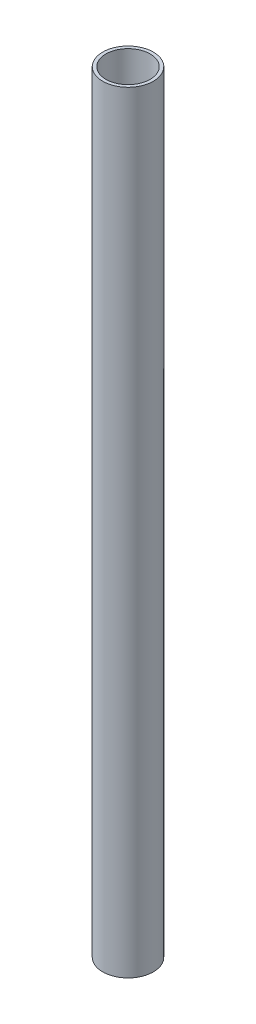
ISO-10303-21;
HEADER;
FILE_DESCRIPTION(('STEP AP214'),'2;1');
FILE_NAME('part.step','',(''),(''),'','','');
FILE_SCHEMA(('AUTOMOTIVE_DESIGN { 1 0 10303 214 1 1 1 1 }'));
ENDSEC;
DATA;
#1=APPLICATION_CONTEXT('core data for automotive mechanical design processes');
#2=APPLICATION_PROTOCOL_DEFINITION('international standard','automotive_design',2000,#1);
#3=PRODUCT_CONTEXT('',#1,'mechanical');
#4=PRODUCT('Part','Part','',(#3));
#5=PRODUCT_RELATED_PRODUCT_CATEGORY('part','',(#4));
#6=PRODUCT_DEFINITION_FORMATION('','',#4);
#7=PRODUCT_DEFINITION_CONTEXT('part definition',#1,'design');
#8=PRODUCT_DEFINITION('design','',#6,#7);
#9=PRODUCT_DEFINITION_SHAPE('','',#8);
#10=(LENGTH_UNIT() NAMED_UNIT(*) SI_UNIT(.MILLI.,.METRE.));
#11=(NAMED_UNIT(*) PLANE_ANGLE_UNIT() SI_UNIT($,.RADIAN.));
#12=(NAMED_UNIT(*) SI_UNIT($,.STERADIAN.) SOLID_ANGLE_UNIT());
#13=UNCERTAINTY_MEASURE_WITH_UNIT(LENGTH_MEASURE(1.E-05),#10,'distance_accuracy_value','');
#14=(GEOMETRIC_REPRESENTATION_CONTEXT(3) GLOBAL_UNCERTAINTY_ASSIGNED_CONTEXT((#13)) GLOBAL_UNIT_ASSIGNED_CONTEXT((#10,
#11,#12)) REPRESENTATION_CONTEXT('',''));
#15=CARTESIAN_POINT('',(0.,0.,0.));
#16=DIRECTION('',(0.,0.,1.));
#17=DIRECTION('',(1.,0.,0.));
#18=AXIS2_PLACEMENT_3D('',#15,#16,#17);
#19=CARTESIAN_POINT('',(327.743353345829,523.888649336886,-1312.55924615483));
#20=DIRECTION('',(0.,1.,0.));
#21=DIRECTION('',(0.,0.,1.));
#22=AXIS2_PLACEMENT_3D('',#19,#20,#21);
#23=PLANE('',#22);
#24=CARTESIAN_POINT('',(327.743353345829,523.888649336886,-1312.55924615483));
#25=DIRECTION('',(0.,1.,0.));
#26=DIRECTION('',(0.,0.,1.));
#27=AXIS2_PLACEMENT_3D('',#24,#25,#26);
#28=CIRCLE('',#27,20.0025);
#29=CARTESIAN_POINT('',(327.743353345829,523.888649336886,-1332.56174615483));
#30=VERTEX_POINT('',#29);
#31=EDGE_CURVE('E10',#30,#30,#28,.T.);
#32=ORIENTED_EDGE('',*,*,#31,.T.);
#33=EDGE_LOOP('',(#32));
#34=FACE_BOUND('',#33,.T.);
#35=CARTESIAN_POINT('',(327.743353345829,523.888649336886,-1312.55924615483));
#36=DIRECTION('',(0.,1.,0.));
#37=DIRECTION('',(0.,0.,1.));
#38=AXIS2_PLACEMENT_3D('',#35,#36,#37);
#39=CIRCLE('',#38,17.4625);
#40=CARTESIAN_POINT('',(327.743353345829,523.888649336886,-1330.02174615483));
#41=VERTEX_POINT('',#40);
#42=EDGE_CURVE('E48',#41,#41,#39,.T.);
#43=ORIENTED_EDGE('',*,*,#42,.F.);
#44=EDGE_LOOP('',(#43));
#45=FACE_BOUND('',#44,.T.);
#46=ADVANCED_FACE('F37',(#34,#45),#23,.T.);
#47=CARTESIAN_POINT('',(327.743353345829,-85.7113506631138,-1312.55924615483));
#48=DIRECTION('',(0.,1.,0.));
#49=DIRECTION('',(0.,0.,1.));
#50=AXIS2_PLACEMENT_3D('',#47,#48,#49);
#51=PLANE('',#50);
#52=CARTESIAN_POINT('',(327.743353345829,-85.7113506631138,-1312.55924615483));
#53=DIRECTION('',(0.,1.,0.));
#54=DIRECTION('',(0.,0.,1.));
#55=AXIS2_PLACEMENT_3D('',#52,#53,#54);
#56=CIRCLE('',#55,20.0025);
#57=CARTESIAN_POINT('',(327.743353345829,-85.7113506631139,-1332.56174615483));
#58=VERTEX_POINT('',#57);
#59=EDGE_CURVE('E41',#58,#58,#56,.T.);
#60=ORIENTED_EDGE('',*,*,#59,.F.);
#61=EDGE_LOOP('',(#60));
#62=FACE_BOUND('',#61,.T.);
#63=CARTESIAN_POINT('',(327.743353345829,-85.7113506631138,-1312.55924615483));
#64=DIRECTION('',(0.,1.,0.));
#65=DIRECTION('',(0.,0.,1.));
#66=AXIS2_PLACEMENT_3D('',#63,#64,#65);
#67=CIRCLE('',#66,17.4625);
#68=CARTESIAN_POINT('',(327.743353345829,-85.7113506631139,-1330.02174615483));
#69=VERTEX_POINT('',#68);
#70=EDGE_CURVE('E50',#69,#69,#67,.T.);
#71=ORIENTED_EDGE('',*,*,#70,.T.);
#72=EDGE_LOOP('',(#71));
#73=FACE_BOUND('',#72,.T.);
#74=ADVANCED_FACE('F60',(#62,#73),#51,.F.);
#75=CARTESIAN_POINT('',(327.743353345829,523.888649336886,-1312.55924615483));
#76=DIRECTION('',(0.,-1.,0.));
#77=DIRECTION('',(0.,0.,-1.));
#78=AXIS2_PLACEMENT_3D('',#75,#76,#77);
#79=CYLINDRICAL_SURFACE('',#78,20.0025);
#80=CARTESIAN_POINT('',(327.743353345829,523.888649336886,-1332.56174615483));
#81=CARTESIAN_POINT('',(327.743353345829,517.538649336886,-1332.56174615483));
#82=CARTESIAN_POINT('',(327.743353345829,511.188649336886,-1332.56174615483));
#83=CARTESIAN_POINT('',(327.743353345829,498.488649336886,-1332.56174615483));
#84=CARTESIAN_POINT('',(327.743353345829,492.138649336886,-1332.56174615483));
#85=CARTESIAN_POINT('',(327.743353345829,479.438649336886,-1332.56174615483));
#86=CARTESIAN_POINT('',(327.743353345829,473.088649336886,-1332.56174615483));
#87=CARTESIAN_POINT('',(327.743353345829,460.388649336886,-1332.56174615483));
#88=CARTESIAN_POINT('',(327.743353345829,454.038649336886,-1332.56174615483));
#89=CARTESIAN_POINT('',(327.743353345829,441.338649336886,-1332.56174615483));
#90=CARTESIAN_POINT('',(327.743353345829,434.988649336886,-1332.56174615483));
#91=CARTESIAN_POINT('',(327.743353345829,422.288649336886,-1332.56174615483));
#92=CARTESIAN_POINT('',(327.743353345829,415.938649336886,-1332.56174615483));
#93=CARTESIAN_POINT('',(327.743353345829,403.238649336886,-1332.56174615483));
#94=CARTESIAN_POINT('',(327.743353345829,396.888649336886,-1332.56174615483));
#95=CARTESIAN_POINT('',(327.743353345829,384.188649336886,-1332.56174615483));
#96=CARTESIAN_POINT('',(327.743353345829,377.838649336886,-1332.56174615483));
#97=CARTESIAN_POINT('',(327.743353345829,365.138649336886,-1332.56174615483));
#98=CARTESIAN_POINT('',(327.743353345829,358.788649336886,-1332.56174615483));
#99=CARTESIAN_POINT('',(327.743353345829,346.088649336886,-1332.56174615483));
#100=CARTESIAN_POINT('',(327.743353345829,339.738649336886,-1332.56174615483));
#101=CARTESIAN_POINT('',(327.743353345829,327.038649336886,-1332.56174615483));
#102=CARTESIAN_POINT('',(327.743353345829,320.688649336886,-1332.56174615483));
#103=CARTESIAN_POINT('',(327.743353345829,307.988649336886,-1332.56174615483));
#104=CARTESIAN_POINT('',(327.743353345829,301.638649336886,-1332.56174615483));
#105=CARTESIAN_POINT('',(327.743353345829,288.938649336886,-1332.56174615483));
#106=CARTESIAN_POINT('',(327.743353345829,282.588649336886,-1332.56174615483));
#107=CARTESIAN_POINT('',(327.743353345829,269.888649336886,-1332.56174615483));
#108=CARTESIAN_POINT('',(327.743353345829,263.538649336886,-1332.56174615483));
#109=CARTESIAN_POINT('',(327.743353345829,250.838649336886,-1332.56174615483));
#110=CARTESIAN_POINT('',(327.743353345829,244.488649336886,-1332.56174615483));
#111=CARTESIAN_POINT('',(327.743353345829,231.788649336886,-1332.56174615483));
#112=CARTESIAN_POINT('',(327.743353345829,225.438649336886,-1332.56174615483));
#113=CARTESIAN_POINT('',(327.743353345829,212.738649336886,-1332.56174615483));
#114=CARTESIAN_POINT('',(327.743353345829,206.388649336886,-1332.56174615483));
#115=CARTESIAN_POINT('',(327.743353345829,193.688649336886,-1332.56174615483));
#116=CARTESIAN_POINT('',(327.743353345829,187.338649336886,-1332.56174615483));
#117=CARTESIAN_POINT('',(327.743353345829,174.638649336886,-1332.56174615483));
#118=CARTESIAN_POINT('',(327.743353345829,168.288649336886,-1332.56174615483));
#119=CARTESIAN_POINT('',(327.743353345829,155.588649336886,-1332.56174615483));
#120=CARTESIAN_POINT('',(327.743353345829,149.238649336886,-1332.56174615483));
#121=CARTESIAN_POINT('',(327.743353345829,136.538649336886,-1332.56174615483));
#122=CARTESIAN_POINT('',(327.743353345829,130.188649336886,-1332.56174615483));
#123=CARTESIAN_POINT('',(327.743353345829,117.488649336886,-1332.56174615483));
#124=CARTESIAN_POINT('',(327.743353345829,111.138649336886,-1332.56174615483));
#125=CARTESIAN_POINT('',(327.743353345829,98.4386493368861,-1332.56174615483));
#126=CARTESIAN_POINT('',(327.743353345829,92.0886493368861,-1332.56174615483));
#127=CARTESIAN_POINT('',(327.743353345829,79.3886493368861,-1332.56174615483));
#128=CARTESIAN_POINT('',(327.743353345829,73.0386493368861,-1332.56174615483));
#129=CARTESIAN_POINT('',(327.743353345829,60.3386493368861,-1332.56174615483));
#130=CARTESIAN_POINT('',(327.743353345829,53.9886493368861,-1332.56174615483));
#131=CARTESIAN_POINT('',(327.743353345829,41.2886493368862,-1332.56174615483));
#132=CARTESIAN_POINT('',(327.743353345829,34.9386493368862,-1332.56174615483));
#133=CARTESIAN_POINT('',(327.743353345829,22.2386493368862,-1332.56174615483));
#134=CARTESIAN_POINT('',(327.743353345829,15.8886493368862,-1332.56174615483));
#135=CARTESIAN_POINT('',(327.743353345829,3.18864933688619,-1332.56174615483));
#136=CARTESIAN_POINT('',(327.743353345829,-3.16135066311381,-1332.56174615483));
#137=CARTESIAN_POINT('',(327.743353345829,-15.8613506631138,-1332.56174615483));
#138=CARTESIAN_POINT('',(327.743353345829,-22.2113506631138,-1332.56174615483));
#139=CARTESIAN_POINT('',(327.743353345829,-34.9113506631138,-1332.56174615483));
#140=CARTESIAN_POINT('',(327.743353345829,-41.2613506631138,-1332.56174615483));
#141=CARTESIAN_POINT('',(327.743353345829,-53.9613506631138,-1332.56174615483));
#142=CARTESIAN_POINT('',(327.743353345829,-60.3113506631138,-1332.56174615483));
#143=CARTESIAN_POINT('',(327.743353345829,-73.0113506631139,-1332.56174615483));
#144=CARTESIAN_POINT('',(327.743353345829,-79.3613506631139,-1332.56174615483));
#145=CARTESIAN_POINT('',(327.743353345829,-85.7113506631139,-1332.56174615483));
#146=B_SPLINE_CURVE_WITH_KNOTS('',3,(#80,#81,#82,#83,#84,#85,#86,#87,#88,#89,#90,#91,#92,#93,
#94,#95,#96,#97,#98,#99,#100,#101,#102,#103,#104,#105,#106,#107,#108,#109,#110,#111,#112,#113,
#114,#115,#116,#117,#118,#119,#120,#121,#122,#123,#124,#125,#126,#127,#128,#129,#130,#131,#132,
#133,#134,#135,#136,#137,#138,#139,#140,#141,#142,#143,#144,#145),.UNSPECIFIED.,.F.,.F.,(4,2,2,
2,2,2,2,2,2,2,2,2,2,2,2,2,2,2,2,2,2,2,2,2,2,2,2,2,2,2,2,2,4),(0.,19.0499999999999,
38.0999999999999,57.1499999999999,76.1999999999999,95.2499999999999,114.3,133.35,152.4,171.45,
190.5,209.55,228.6,247.65,266.7,285.75,304.8,323.85,342.9,361.95,381.,400.05,419.1,438.15,457.2,
476.25,495.3,514.35,533.4,552.45,571.5,590.55,609.6),.UNSPECIFIED.);
#147=EDGE_CURVE('BSEAM39',#30,#58,#146,.T.);
#148=ORIENTED_EDGE('',*,*,#31,.F.);
#149=ORIENTED_EDGE('',*,*,#59,.T.);
#150=ORIENTED_EDGE('',*,*,#147,.T.);
#151=ORIENTED_EDGE('',*,*,#147,.F.);
#152=EDGE_LOOP('',(#148,#150,#149,#151));
#153=FACE_BOUND('',#152,.T.);
#154=ADVANCED_FACE('F39',(#153),#79,.T.);
#155=CARTESIAN_POINT('',(327.743353345829,523.888649336886,-1312.55924615483));
#156=DIRECTION('',(0.,-1.,0.));
#157=DIRECTION('',(0.,0.,-1.));
#158=AXIS2_PLACEMENT_3D('',#155,#156,#157);
#159=CYLINDRICAL_SURFACE('',#158,17.4625);
#160=CARTESIAN_POINT('',(327.743353345829,523.888649336886,-1330.02174615483));
#161=CARTESIAN_POINT('',(327.743353345829,517.538649336886,-1330.02174615483));
#162=CARTESIAN_POINT('',(327.743353345829,511.188649336886,-1330.02174615483));
#163=CARTESIAN_POINT('',(327.743353345829,498.488649336886,-1330.02174615483));
#164=CARTESIAN_POINT('',(327.743353345829,492.138649336886,-1330.02174615483));
#165=CARTESIAN_POINT('',(327.743353345829,479.438649336886,-1330.02174615483));
#166=CARTESIAN_POINT('',(327.743353345829,473.088649336886,-1330.02174615483));
#167=CARTESIAN_POINT('',(327.743353345829,460.388649336886,-1330.02174615483));
#168=CARTESIAN_POINT('',(327.743353345829,454.038649336886,-1330.02174615483));
#169=CARTESIAN_POINT('',(327.743353345829,441.338649336886,-1330.02174615483));
#170=CARTESIAN_POINT('',(327.743353345829,434.988649336886,-1330.02174615483));
#171=CARTESIAN_POINT('',(327.743353345829,422.288649336886,-1330.02174615483));
#172=CARTESIAN_POINT('',(327.743353345829,415.938649336886,-1330.02174615483));
#173=CARTESIAN_POINT('',(327.743353345829,403.238649336886,-1330.02174615483));
#174=CARTESIAN_POINT('',(327.743353345829,396.888649336886,-1330.02174615483));
#175=CARTESIAN_POINT('',(327.743353345829,384.188649336886,-1330.02174615483));
#176=CARTESIAN_POINT('',(327.743353345829,377.838649336886,-1330.02174615483));
#177=CARTESIAN_POINT('',(327.743353345829,365.138649336886,-1330.02174615483));
#178=CARTESIAN_POINT('',(327.743353345829,358.788649336886,-1330.02174615483));
#179=CARTESIAN_POINT('',(327.743353345829,346.088649336886,-1330.02174615483));
#180=CARTESIAN_POINT('',(327.743353345829,339.738649336886,-1330.02174615483));
#181=CARTESIAN_POINT('',(327.743353345829,327.038649336886,-1330.02174615483));
#182=CARTESIAN_POINT('',(327.743353345829,320.688649336886,-1330.02174615483));
#183=CARTESIAN_POINT('',(327.743353345829,307.988649336886,-1330.02174615483));
#184=CARTESIAN_POINT('',(327.743353345829,301.638649336886,-1330.02174615483));
#185=CARTESIAN_POINT('',(327.743353345829,288.938649336886,-1330.02174615483));
#186=CARTESIAN_POINT('',(327.743353345829,282.588649336886,-1330.02174615483));
#187=CARTESIAN_POINT('',(327.743353345829,269.888649336886,-1330.02174615483));
#188=CARTESIAN_POINT('',(327.743353345829,263.538649336886,-1330.02174615483));
#189=CARTESIAN_POINT('',(327.743353345829,250.838649336886,-1330.02174615483));
#190=CARTESIAN_POINT('',(327.743353345829,244.488649336886,-1330.02174615483));
#191=CARTESIAN_POINT('',(327.743353345829,231.788649336886,-1330.02174615483));
#192=CARTESIAN_POINT('',(327.743353345829,225.438649336886,-1330.02174615483));
#193=CARTESIAN_POINT('',(327.743353345829,212.738649336886,-1330.02174615483));
#194=CARTESIAN_POINT('',(327.743353345829,206.388649336886,-1330.02174615483));
#195=CARTESIAN_POINT('',(327.743353345829,193.688649336886,-1330.02174615483));
#196=CARTESIAN_POINT('',(327.743353345829,187.338649336886,-1330.02174615483));
#197=CARTESIAN_POINT('',(327.743353345829,174.638649336886,-1330.02174615483));
#198=CARTESIAN_POINT('',(327.743353345829,168.288649336886,-1330.02174615483));
#199=CARTESIAN_POINT('',(327.743353345829,155.588649336886,-1330.02174615483));
#200=CARTESIAN_POINT('',(327.743353345829,149.238649336886,-1330.02174615483));
#201=CARTESIAN_POINT('',(327.743353345829,136.538649336886,-1330.02174615483));
#202=CARTESIAN_POINT('',(327.743353345829,130.188649336886,-1330.02174615483));
#203=CARTESIAN_POINT('',(327.743353345829,117.488649336886,-1330.02174615483));
#204=CARTESIAN_POINT('',(327.743353345829,111.138649336886,-1330.02174615483));
#205=CARTESIAN_POINT('',(327.743353345829,98.4386493368861,-1330.02174615483));
#206=CARTESIAN_POINT('',(327.743353345829,92.0886493368861,-1330.02174615483));
#207=CARTESIAN_POINT('',(327.743353345829,79.3886493368861,-1330.02174615483));
#208=CARTESIAN_POINT('',(327.743353345829,73.0386493368861,-1330.02174615483));
#209=CARTESIAN_POINT('',(327.743353345829,60.3386493368861,-1330.02174615483));
#210=CARTESIAN_POINT('',(327.743353345829,53.9886493368861,-1330.02174615483));
#211=CARTESIAN_POINT('',(327.743353345829,41.288649336886,-1330.02174615483));
#212=CARTESIAN_POINT('',(327.743353345829,34.938649336886,-1330.02174615483));
#213=CARTESIAN_POINT('',(327.743353345829,22.2386493368861,-1330.02174615483));
#214=CARTESIAN_POINT('',(327.743353345829,15.8886493368861,-1330.02174615483));
#215=CARTESIAN_POINT('',(327.743353345829,3.18864933688619,-1330.02174615483));
#216=CARTESIAN_POINT('',(327.743353345829,-3.16135066311381,-1330.02174615483));
#217=CARTESIAN_POINT('',(327.743353345829,-15.8613506631138,-1330.02174615483));
#218=CARTESIAN_POINT('',(327.743353345829,-22.2113506631138,-1330.02174615483));
#219=CARTESIAN_POINT('',(327.743353345829,-34.9113506631138,-1330.02174615483));
#220=CARTESIAN_POINT('',(327.743353345829,-41.2613506631138,-1330.02174615483));
#221=CARTESIAN_POINT('',(327.743353345829,-53.9613506631138,-1330.02174615483));
#222=CARTESIAN_POINT('',(327.743353345829,-60.3113506631138,-1330.02174615483));
#223=CARTESIAN_POINT('',(327.743353345829,-73.0113506631139,-1330.02174615483));
#224=CARTESIAN_POINT('',(327.743353345829,-79.3613506631139,-1330.02174615483));
#225=CARTESIAN_POINT('',(327.743353345829,-85.7113506631139,-1330.02174615483));
#226=B_SPLINE_CURVE_WITH_KNOTS('',3,(#160,#161,#162,#163,#164,#165,#166,#167,#168,#169,#170,
#171,#172,#173,#174,#175,#176,#177,#178,#179,#180,#181,#182,#183,#184,#185,#186,#187,#188,#189,
#190,#191,#192,#193,#194,#195,#196,#197,#198,#199,#200,#201,#202,#203,#204,#205,#206,#207,#208,
#209,#210,#211,#212,#213,#214,#215,#216,#217,#218,#219,#220,#221,#222,#223,#224,#225),
.UNSPECIFIED.,.F.,.F.,(4,2,2,2,2,2,2,2,2,2,2,2,2,2,2,2,2,2,2,2,2,2,2,2,2,2,2,2,2,2,2,2,4),(0.,
19.05,38.1000000000001,57.15,76.2,95.2500000000001,114.3,133.35,152.4,171.45,190.5,209.55,228.6,
247.65,266.7,285.75,304.8,323.85,342.9,361.95,381.,400.05,419.1,438.15,457.2,476.25,495.3,
514.35,533.4,552.45,571.5,590.55,609.6),.UNSPECIFIED.);
#227=EDGE_CURVE('BSEAM56',#41,#69,#226,.T.);
#228=ORIENTED_EDGE('',*,*,#42,.T.);
#229=ORIENTED_EDGE('',*,*,#70,.F.);
#230=ORIENTED_EDGE('',*,*,#227,.T.);
#231=ORIENTED_EDGE('',*,*,#227,.F.);
#232=EDGE_LOOP('',(#228,#230,#229,#231));
#233=FACE_BOUND('',#232,.T.);
#234=ADVANCED_FACE('F56',(#233),#159,.F.);
#235=CLOSED_SHELL('',(#46,#74,#154,#234));
#236=MANIFOLD_SOLID_BREP('B2',#235);
#237=ADVANCED_BREP_SHAPE_REPRESENTATION('',(#18,#236),#14);
#238=SHAPE_DEFINITION_REPRESENTATION(#9,#237);
ENDSEC;
END-ISO-10303-21;
